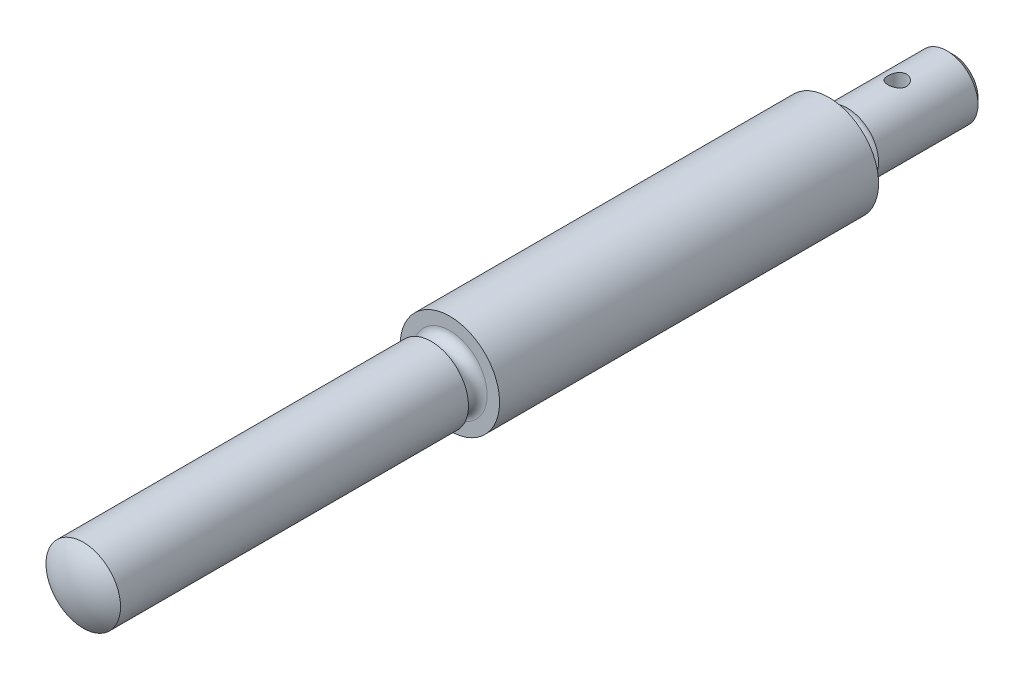
ISO-10303-21;
HEADER;
FILE_DESCRIPTION(('STEP AP214'),'2;1');
FILE_NAME('part.step','',(''),(''),'','','');
FILE_SCHEMA(('AUTOMOTIVE_DESIGN { 1 0 10303 214 1 1 1 1 }'));
ENDSEC;
DATA;
#1=APPLICATION_CONTEXT('core data for automotive mechanical design processes');
#2=APPLICATION_PROTOCOL_DEFINITION('international standard','automotive_design',2000,#1);
#3=PRODUCT_CONTEXT('',#1,'mechanical');
#4=PRODUCT('Part','Part','',(#3));
#5=PRODUCT_RELATED_PRODUCT_CATEGORY('part','',(#4));
#6=PRODUCT_DEFINITION_FORMATION('','',#4);
#7=PRODUCT_DEFINITION_CONTEXT('part definition',#1,'design');
#8=PRODUCT_DEFINITION('design','',#6,#7);
#9=PRODUCT_DEFINITION_SHAPE('','',#8);
#10=(LENGTH_UNIT() NAMED_UNIT(*) SI_UNIT(.MILLI.,.METRE.));
#11=(NAMED_UNIT(*) PLANE_ANGLE_UNIT() SI_UNIT($,.RADIAN.));
#12=(NAMED_UNIT(*) SI_UNIT($,.STERADIAN.) SOLID_ANGLE_UNIT());
#13=UNCERTAINTY_MEASURE_WITH_UNIT(LENGTH_MEASURE(1.E-05),#10,'distance_accuracy_value','');
#14=(GEOMETRIC_REPRESENTATION_CONTEXT(3) GLOBAL_UNCERTAINTY_ASSIGNED_CONTEXT((#13)) GLOBAL_UNIT_ASSIGNED_CONTEXT((#10,
#11,#12)) REPRESENTATION_CONTEXT('',''));
#15=CARTESIAN_POINT('',(0.,0.,0.));
#16=DIRECTION('',(0.,0.,1.));
#17=DIRECTION('',(1.,0.,0.));
#18=AXIS2_PLACEMENT_3D('',#15,#16,#17);
#19=CARTESIAN_POINT('',(0.,0.,-10.));
#20=DIRECTION('',(0.,0.,1.));
#21=DIRECTION('',(0.,1.,0.));
#22=AXIS2_PLACEMENT_3D('',#19,#20,#21);
#23=SPHERICAL_SURFACE('',#22,10.);
#24=CARTESIAN_POINT('',(0.,0.,-2.));
#25=DIRECTION('',(0.,0.,1.));
#26=DIRECTION('',(1.,0.,0.));
#27=AXIS2_PLACEMENT_3D('',#24,#25,#26);
#28=CIRCLE('',#27,6.);
#29=CARTESIAN_POINT('',(6.,0.,-2.));
#30=VERTEX_POINT('',#29);
#31=EDGE_CURVE('E53',#30,#30,#28,.T.);
#32=ORIENTED_EDGE('',*,*,#31,.T.);
#33=EDGE_LOOP('',(#32));
#34=FACE_BOUND('',#33,.T.);
#35=ADVANCED_FACE('F28',(#34),#23,.T.);
#36=CARTESIAN_POINT('',(0.,5.,-142.));
#37=DIRECTION('',(0.,0.,1.));
#38=DIRECTION('',(1.,0.,0.));
#39=AXIS2_PLACEMENT_3D('',#36,#37,#38);
#40=PLANE('',#39);
#41=CARTESIAN_POINT('',(0.,0.,-142.));
#42=DIRECTION('',(0.,0.,1.));
#43=DIRECTION('',(1.,0.,0.));
#44=AXIS2_PLACEMENT_3D('',#41,#42,#43);
#45=CIRCLE('',#44,4.00000000000002);
#46=CARTESIAN_POINT('',(4.00000000000002,0.,-142.));
#47=VERTEX_POINT('',#46);
#48=EDGE_CURVE('E10',#47,#47,#45,.F.);
#49=ORIENTED_EDGE('',*,*,#48,.T.);
#50=EDGE_LOOP('',(#49));
#51=FACE_BOUND('',#50,.T.);
#52=ADVANCED_FACE('F92',(#51),#40,.F.);
#53=CARTESIAN_POINT('',(0.,0.,0.));
#54=DIRECTION('',(0.,0.,1.));
#55=DIRECTION('',(1.,0.,0.));
#56=AXIS2_PLACEMENT_3D('',#53,#54,#55);
#57=CYLINDRICAL_SURFACE('',#56,5.);
#58=CARTESIAN_POINT('',(0.,0.,-141.));
#59=DIRECTION('',(0.,0.,1.));
#60=DIRECTION('',(1.,0.,0.));
#61=AXIS2_PLACEMENT_3D('',#58,#59,#60);
#62=CIRCLE('',#61,5.);
#63=CARTESIAN_POINT('',(5.,0.,-141.));
#64=VERTEX_POINT('',#63);
#65=EDGE_CURVE('E35',#64,#64,#62,.T.);
#66=ORIENTED_EDGE('',*,*,#65,.T.);
#67=EDGE_LOOP('',(#66));
#68=FACE_BOUND('',#67,.T.);
#69=CARTESIAN_POINT('',(0.,-5.,-131.5));
#70=CARTESIAN_POINT('',(0.0822886127532996,-4.9999992925055,-131.500000997485));
#71=CARTESIAN_POINT('',(0.16458731835153,-4.99794915693954,-131.506793863624));
#72=CARTESIAN_POINT('',(0.32678812530488,-4.98997105593691,-131.533721354222));
#73=CARTESIAN_POINT('',(0.406689504411418,-4.98404193389692,-131.553859958023));
#74=CARTESIAN_POINT('',(0.561732707754521,-4.96895552501837,-131.60674601691));
#75=CARTESIAN_POINT('',(0.636881364395366,-4.95980300250426,-131.639474869619));
#76=CARTESIAN_POINT('',(0.780624181053126,-4.93922109237646,-131.716536093056));
#77=CARTESIAN_POINT('',(0.849217467469667,-4.92779140192067,-131.760870007395));
#78=CARTESIAN_POINT('',(0.979871797183742,-4.90350737192774,-131.861224007473));
#79=CARTESIAN_POINT('',(1.04171807124433,-4.89062383657037,-131.917516625886));
#80=CARTESIAN_POINT('',(1.15524920923323,-4.86505834210443,-132.03960922991));
#81=CARTESIAN_POINT('',(1.2069323632744,-4.85237641724502,-132.105410812125));
#82=CARTESIAN_POINT('',(1.29980037723707,-4.82834113993772,-132.246470753038));
#83=CARTESIAN_POINT('',(1.34072309022212,-4.81702406663875,-132.321908460991));
#84=CARTESIAN_POINT('',(1.4092139477476,-4.79743620394031,-132.47898925423));
#85=CARTESIAN_POINT('',(1.43678529919973,-4.78916468313311,-132.560630843928));
#86=CARTESIAN_POINT('',(1.47701633682651,-4.77690870838434,-132.72539026613));
#87=CARTESIAN_POINT('',(1.49007196234677,-4.77281069324533,-132.808402743864));
#88=CARTESIAN_POINT('',(1.50213730614672,-4.76902789749767,-132.975533156217));
#89=CARTESIAN_POINT('',(1.50115042761078,-4.76934204760571,-133.059650818059));
#90=CARTESIAN_POINT('',(1.48546977199812,-4.77424744067778,-133.223383908608));
#91=CARTESIAN_POINT('',(1.47127205262686,-4.77868388599141,-133.303052250362));
#92=CARTESIAN_POINT('',(1.43037420427057,-4.79108356228624,-133.458819786273));
#93=CARTESIAN_POINT('',(1.40367284141642,-4.7990471413235,-133.534918627374));
#94=CARTESIAN_POINT('',(1.33816026653683,-4.81772733074973,-133.682600349661));
#95=CARTESIAN_POINT('',(1.29918816934644,-4.82848016115952,-133.754107083955));
#96=CARTESIAN_POINT('',(1.21035222588685,-4.85150987000064,-133.88973202201));
#97=CARTESIAN_POINT('',(1.16048574002589,-4.86378711746991,-133.953848429414));
#98=CARTESIAN_POINT('',(1.04881290765548,-4.88911011297937,-134.075686190762));
#99=CARTESIAN_POINT('',(0.986594907466989,-4.90216654310498,-134.13302866403));
#100=CARTESIAN_POINT('',(0.85326325931398,-4.92712244063258,-134.236553984064));
#101=CARTESIAN_POINT('',(0.782149051860893,-4.9390218351841,-134.282736128414));
#102=CARTESIAN_POINT('',(0.632355038342801,-4.9604316006947,-134.362859922465));
#103=CARTESIAN_POINT('',(0.553627749747948,-4.96992543668314,-134.39671751625));
#104=CARTESIAN_POINT('',(0.391245415603517,-4.98533521832222,-134.4505995901));
#105=CARTESIAN_POINT('',(0.30759175158958,-4.99125216186999,-134.470627928533));
#106=CARTESIAN_POINT('',(0.140952242668333,-4.99868364643538,-134.495652177899));
#107=CARTESIAN_POINT('',(0.0580500976011894,-5.0003485041779,-134.501161585802));
#108=CARTESIAN_POINT('',(-0.107499605823379,-4.9995292324176,-134.498430844288));
#109=CARTESIAN_POINT('',(-0.190147196690776,-4.99704565677757,-134.490192530349));
#110=CARTESIAN_POINT('',(-0.350903605309691,-4.98830696987163,-134.460615388888));
#111=CARTESIAN_POINT('',(-0.429072772614163,-4.98213829799417,-134.439576612419));
#112=CARTESIAN_POINT('',(-0.580754638954516,-4.96674347841533,-134.385356767222));
#113=CARTESIAN_POINT('',(-0.654266777025579,-4.95751696321085,-134.352174238962));
#114=CARTESIAN_POINT('',(-0.796437189461048,-4.93669654351325,-134.273746834519));
#115=CARTESIAN_POINT('',(-0.864943826199664,-4.92505280829675,-134.228240659052));
#116=CARTESIAN_POINT('',(-0.993523307980143,-4.90073468764318,-134.126775245947));
#117=CARTESIAN_POINT('',(-1.05359403235593,-4.8880600443108,-134.070813388112));
#118=CARTESIAN_POINT('',(-1.16585744551028,-4.86253171869138,-133.947612691631));
#119=CARTESIAN_POINT('',(-1.21768481231505,-4.84968825033267,-133.880038124228));
#120=CARTESIAN_POINT('',(-1.30928995072154,-4.82576515238463,-133.736872060986));
#121=CARTESIAN_POINT('',(-1.34906803829472,-4.81468547654651,-133.661280775442));
#122=CARTESIAN_POINT('',(-1.41517347127168,-4.79567189615055,-133.504467508745));
#123=CARTESIAN_POINT('',(-1.4415634693705,-4.78772337843827,-133.423273813463));
#124=CARTESIAN_POINT('',(-1.48021730815114,-4.77591594362794,-133.257312031069));
#125=CARTESIAN_POINT('',(-1.49248598978779,-4.772055625083,-133.172545179212));
#126=CARTESIAN_POINT('',(-1.50221984485059,-4.76899972496087,-133.005638481624));
#127=CARTESIAN_POINT('',(-1.5002805530849,-4.76961647442754,-132.923536348982));
#128=CARTESIAN_POINT('',(-1.48307505444813,-4.77499401288294,-132.760885896627));
#129=CARTESIAN_POINT('',(-1.46780938124716,-4.77975463592551,-132.680337514824));
#130=CARTESIAN_POINT('',(-1.42476888804135,-4.79275763670386,-132.524054600857));
#131=CARTESIAN_POINT('',(-1.39715175507068,-4.80095604545965,-132.448272712638));
#132=CARTESIAN_POINT('',(-1.33031507121128,-4.81990278909137,-132.302357561182));
#133=CARTESIAN_POINT('',(-1.29109329962875,-4.83065161194312,-132.232225382359));
#134=CARTESIAN_POINT('',(-1.20048763805071,-4.85397676425833,-132.096836883473));
#135=CARTESIAN_POINT('',(-1.14871276092994,-4.86660540163798,-132.03185123874));
#136=CARTESIAN_POINT('',(-1.03517434629782,-4.89201320450026,-131.911297501692));
#137=CARTESIAN_POINT('',(-0.973408217134502,-4.90479240823905,-131.855731860532));
#138=CARTESIAN_POINT('',(-0.839465762183243,-4.92950936570649,-131.753976587705));
#139=CARTESIAN_POINT('',(-0.7670378857906,-4.94141159765674,-131.708108553145));
#140=CARTESIAN_POINT('',(-0.615141373983523,-4.96260680455813,-131.629264830096));
#141=CARTESIAN_POINT('',(-0.535676052998952,-4.97190099931067,-131.596283111726));
#142=CARTESIAN_POINT('',(-0.380757712655279,-4.98602174969301,-131.547104724347));
#143=CARTESIAN_POINT('',(-0.30578696195423,-4.99122027381068,-131.529488327117));
#144=CARTESIAN_POINT('',(-0.153880195230776,-4.99820944494492,-131.505936474758));
#145=CARTESIAN_POINT('',(-0.0769445098581383,-5.0000006615474,-131.499999067295));
#146=CARTESIAN_POINT('',(0.,-5.,-131.5));
#147=B_SPLINE_CURVE_WITH_KNOTS('',3,(#69,#70,#71,#72,#73,#74,#75,#76,#77,#78,#79,#80,#81,#82,
#83,#84,#85,#86,#87,#88,#89,#90,#91,#92,#93,#94,#95,#96,#97,#98,#99,#100,#101,#102,#103,#104,
#105,#106,#107,#108,#109,#110,#111,#112,#113,#114,#115,#116,#117,#118,#119,#120,#121,#122,#123,
#124,#125,#126,#127,#128,#129,#130,#131,#132,#133,#134,#135,#136,#137,#138,#139,#140,#141,#142,
#143,#144,#145,#146),.UNSPECIFIED.,.T.,.F.,(4,2,2,2,2,2,2,2,2,2,2,2,2,2,2,2,2,2,2,2,2,2,2,2,2,2,
2,2,2,2,2,2,2,2,2,2,2,2,4),(0.,0.246583203612611,0.493239964845998,0.739533676300867,
0.98586016441269,1.2385560294819,1.49129437288632,1.74971481004104,2.00807314543225,
2.25919689356599,2.51025978319089,2.75226016697672,2.99428443657998,3.23962426447116,
3.48502360158553,3.74067104048165,3.9963345653107,4.25371046881689,4.51101453528807,
4.75908809438544,5.00712853550326,5.24956746682326,5.49203554593728,5.74011305702908,
5.98825282000192,6.2454040032282,6.5025484425268,6.75847814951252,7.01432009460282,
7.25950155466945,7.50467319661602,7.74680040402721,7.98897397553108,8.2399692567993,
8.49102974897501,8.7494299615667,9.00770911595235,9.23831691930459,9.46888616948873),.UNSPECIFIED.);
#148=CARTESIAN_POINT('',(0.,-5.,-131.5));
#149=VERTEX_POINT('',#148);
#150=EDGE_CURVE('E46',#149,#149,#147,.T.);
#151=ORIENTED_EDGE('',*,*,#150,.T.);
#152=EDGE_LOOP('',(#151));
#153=FACE_BOUND('',#152,.T.);
#154=CARTESIAN_POINT('',(0.,5.,-131.5));
#155=CARTESIAN_POINT('',(-0.0822886127532996,4.9999992925055,-131.500000997485));
#156=CARTESIAN_POINT('',(-0.16458731835153,4.99794915693954,-131.506793863624));
#157=CARTESIAN_POINT('',(-0.32678812530488,4.98997105593691,-131.533721354222));
#158=CARTESIAN_POINT('',(-0.406689504411418,4.98404193389692,-131.553859958023));
#159=CARTESIAN_POINT('',(-0.561732707754521,4.96895552501837,-131.60674601691));
#160=CARTESIAN_POINT('',(-0.636881364395366,4.95980300250426,-131.639474869619));
#161=CARTESIAN_POINT('',(-0.780624181053126,4.93922109237646,-131.716536093056));
#162=CARTESIAN_POINT('',(-0.849217467469667,4.92779140192067,-131.760870007395));
#163=CARTESIAN_POINT('',(-0.979871797183742,4.90350737192774,-131.861224007473));
#164=CARTESIAN_POINT('',(-1.04171807124433,4.89062383657037,-131.917516625886));
#165=CARTESIAN_POINT('',(-1.15524920923323,4.86505834210443,-132.03960922991));
#166=CARTESIAN_POINT('',(-1.2069323632744,4.85237641724502,-132.105410812125));
#167=CARTESIAN_POINT('',(-1.29980037723707,4.82834113993772,-132.246470753038));
#168=CARTESIAN_POINT('',(-1.34072309022212,4.81702406663875,-132.321908460991));
#169=CARTESIAN_POINT('',(-1.4092139477476,4.79743620394031,-132.47898925423));
#170=CARTESIAN_POINT('',(-1.43678529919973,4.78916468313311,-132.560630843928));
#171=CARTESIAN_POINT('',(-1.47701633682651,4.77690870838434,-132.72539026613));
#172=CARTESIAN_POINT('',(-1.49007196234677,4.77281069324533,-132.808402743864));
#173=CARTESIAN_POINT('',(-1.50213730614672,4.76902789749767,-132.975533156217));
#174=CARTESIAN_POINT('',(-1.50115042761078,4.76934204760571,-133.059650818059));
#175=CARTESIAN_POINT('',(-1.48546977199812,4.77424744067778,-133.223383908608));
#176=CARTESIAN_POINT('',(-1.47127205262686,4.77868388599141,-133.303052250362));
#177=CARTESIAN_POINT('',(-1.43037420427057,4.79108356228624,-133.458819786273));
#178=CARTESIAN_POINT('',(-1.40367284141642,4.7990471413235,-133.534918627374));
#179=CARTESIAN_POINT('',(-1.33816026653683,4.81772733074973,-133.682600349661));
#180=CARTESIAN_POINT('',(-1.29918816934644,4.82848016115952,-133.754107083955));
#181=CARTESIAN_POINT('',(-1.21035222588685,4.85150987000064,-133.88973202201));
#182=CARTESIAN_POINT('',(-1.16048574002589,4.86378711746991,-133.953848429414));
#183=CARTESIAN_POINT('',(-1.04881290765548,4.88911011297937,-134.075686190762));
#184=CARTESIAN_POINT('',(-0.986594907466989,4.90216654310498,-134.13302866403));
#185=CARTESIAN_POINT('',(-0.85326325931398,4.92712244063258,-134.236553984064));
#186=CARTESIAN_POINT('',(-0.782149051860893,4.9390218351841,-134.282736128414));
#187=CARTESIAN_POINT('',(-0.632355038342801,4.9604316006947,-134.362859922465));
#188=CARTESIAN_POINT('',(-0.553627749747948,4.96992543668314,-134.39671751625));
#189=CARTESIAN_POINT('',(-0.391245415603517,4.98533521832222,-134.4505995901));
#190=CARTESIAN_POINT('',(-0.30759175158958,4.99125216186999,-134.470627928533));
#191=CARTESIAN_POINT('',(-0.140952242668333,4.99868364643538,-134.495652177899));
#192=CARTESIAN_POINT('',(-0.0580500976011894,5.0003485041779,-134.501161585802));
#193=CARTESIAN_POINT('',(0.107499605823379,4.9995292324176,-134.498430844288));
#194=CARTESIAN_POINT('',(0.190147196690776,4.99704565677757,-134.490192530349));
#195=CARTESIAN_POINT('',(0.350903605309691,4.98830696987163,-134.460615388888));
#196=CARTESIAN_POINT('',(0.429072772614163,4.98213829799417,-134.439576612419));
#197=CARTESIAN_POINT('',(0.580754638954516,4.96674347841533,-134.385356767222));
#198=CARTESIAN_POINT('',(0.654266777025579,4.95751696321085,-134.352174238962));
#199=CARTESIAN_POINT('',(0.796437189461048,4.93669654351325,-134.273746834519));
#200=CARTESIAN_POINT('',(0.864943826199664,4.92505280829675,-134.228240659052));
#201=CARTESIAN_POINT('',(0.993523307980143,4.90073468764318,-134.126775245947));
#202=CARTESIAN_POINT('',(1.05359403235593,4.8880600443108,-134.070813388112));
#203=CARTESIAN_POINT('',(1.16585744551028,4.86253171869138,-133.947612691631));
#204=CARTESIAN_POINT('',(1.21768481231505,4.84968825033267,-133.880038124228));
#205=CARTESIAN_POINT('',(1.30928995072154,4.82576515238463,-133.736872060986));
#206=CARTESIAN_POINT('',(1.34906803829472,4.81468547654651,-133.661280775442));
#207=CARTESIAN_POINT('',(1.41517347127168,4.79567189615055,-133.504467508745));
#208=CARTESIAN_POINT('',(1.4415634693705,4.78772337843827,-133.423273813463));
#209=CARTESIAN_POINT('',(1.48021730815114,4.77591594362794,-133.257312031069));
#210=CARTESIAN_POINT('',(1.49248598978779,4.772055625083,-133.172545179212));
#211=CARTESIAN_POINT('',(1.50221984485059,4.76899972496087,-133.005638481624));
#212=CARTESIAN_POINT('',(1.5002805530849,4.76961647442754,-132.923536348982));
#213=CARTESIAN_POINT('',(1.48307505444813,4.77499401288294,-132.760885896627));
#214=CARTESIAN_POINT('',(1.46780938124716,4.77975463592551,-132.680337514824));
#215=CARTESIAN_POINT('',(1.42476888804135,4.79275763670386,-132.524054600857));
#216=CARTESIAN_POINT('',(1.39715175507068,4.80095604545965,-132.448272712638));
#217=CARTESIAN_POINT('',(1.33031507121128,4.81990278909137,-132.302357561182));
#218=CARTESIAN_POINT('',(1.29109329962875,4.83065161194312,-132.232225382359));
#219=CARTESIAN_POINT('',(1.20048763805071,4.85397676425833,-132.096836883473));
#220=CARTESIAN_POINT('',(1.14871276092994,4.86660540163798,-132.03185123874));
#221=CARTESIAN_POINT('',(1.03517434629782,4.89201320450026,-131.911297501692));
#222=CARTESIAN_POINT('',(0.973408217134502,4.90479240823905,-131.855731860532));
#223=CARTESIAN_POINT('',(0.839465762183243,4.92950936570649,-131.753976587705));
#224=CARTESIAN_POINT('',(0.7670378857906,4.94141159765674,-131.708108553145));
#225=CARTESIAN_POINT('',(0.615141373983523,4.96260680455813,-131.629264830096));
#226=CARTESIAN_POINT('',(0.535676052998952,4.97190099931067,-131.596283111726));
#227=CARTESIAN_POINT('',(0.380757712655279,4.98602174969301,-131.547104724347));
#228=CARTESIAN_POINT('',(0.30578696195423,4.99122027381068,-131.529488327117));
#229=CARTESIAN_POINT('',(0.153880195230776,4.99820944494492,-131.505936474758));
#230=CARTESIAN_POINT('',(0.0769445098581383,5.0000006615474,-131.499999067295));
#231=CARTESIAN_POINT('',(0.,5.,-131.5));
#232=B_SPLINE_CURVE_WITH_KNOTS('',3,(#154,#155,#156,#157,#158,#159,#160,#161,#162,#163,#164,
#165,#166,#167,#168,#169,#170,#171,#172,#173,#174,#175,#176,#177,#178,#179,#180,#181,#182,#183,
#184,#185,#186,#187,#188,#189,#190,#191,#192,#193,#194,#195,#196,#197,#198,#199,#200,#201,#202,
#203,#204,#205,#206,#207,#208,#209,#210,#211,#212,#213,#214,#215,#216,#217,#218,#219,#220,#221,
#222,#223,#224,#225,#226,#227,#228,#229,#230,#231),.UNSPECIFIED.,.T.,.F.,(4,2,2,2,2,2,2,2,2,2,2,
2,2,2,2,2,2,2,2,2,2,2,2,2,2,2,2,2,2,2,2,2,2,2,2,2,2,2,4),(0.,0.246583203612611,
0.493239964845998,0.739533676300867,0.98586016441269,1.2385560294819,1.49129437288632,
1.74971481004104,2.00807314543225,2.25919689356599,2.51025978319089,2.75226016697672,
2.99428443657998,3.23962426447116,3.48502360158553,3.74067104048165,3.9963345653107,
4.25371046881689,4.51101453528807,4.75908809438544,5.00712853550326,5.24956746682326,
5.49203554593728,5.74011305702908,5.98825282000192,6.2454040032282,6.5025484425268,
6.75847814951252,7.01432009460282,7.25950155466945,7.50467319661602,7.74680040402721,
7.98897397553108,8.2399692567993,8.49102974897501,8.7494299615667,9.00770911595235,
9.23831691930459,9.46888616948873),.UNSPECIFIED.);
#233=CARTESIAN_POINT('',(0.,5.,-131.5));
#234=VERTEX_POINT('',#233);
#235=EDGE_CURVE('E54',#234,#234,#232,.T.);
#236=ORIENTED_EDGE('',*,*,#235,.T.);
#237=EDGE_LOOP('',(#236));
#238=FACE_BOUND('',#237,.T.);
#239=CARTESIAN_POINT('',(0.,0.,-125.));
#240=DIRECTION('',(0.,0.,1.));
#241=DIRECTION('',(1.,0.,0.));
#242=AXIS2_PLACEMENT_3D('',#239,#240,#241);
#243=CIRCLE('',#242,5.);
#244=CARTESIAN_POINT('',(5.,0.,-125.));
#245=VERTEX_POINT('',#244);
#246=EDGE_CURVE('E39',#245,#245,#243,.T.);
#247=ORIENTED_EDGE('',*,*,#246,.F.);
#248=EDGE_LOOP('',(#247));
#249=FACE_BOUND('',#248,.T.);
#250=ADVANCED_FACE('F57',(#68,#153,#238,#249),#57,.T.);
#251=CARTESIAN_POINT('',(0.,0.,-123.5));
#252=DIRECTION('',(0.,0.,1.));
#253=DIRECTION('',(1.,0.,0.));
#254=AXIS2_PLACEMENT_3D('',#251,#252,#253);
#255=TOROIDAL_SURFACE('',#254,5.,1.5);
#256=CARTESIAN_POINT('',(0.,0.,-122.));
#257=DIRECTION('',(0.,0.,1.));
#258=DIRECTION('',(1.,0.,0.));
#259=AXIS2_PLACEMENT_3D('',#256,#257,#258);
#260=CIRCLE('',#259,5.);
#261=CARTESIAN_POINT('',(5.,0.,-122.));
#262=VERTEX_POINT('',#261);
#263=EDGE_CURVE('E43',#262,#262,#260,.T.);
#264=ORIENTED_EDGE('',*,*,#263,.F.);
#265=EDGE_LOOP('',(#264));
#266=FACE_BOUND('',#265,.T.);
#267=ORIENTED_EDGE('',*,*,#246,.T.);
#268=EDGE_LOOP('',(#267));
#269=FACE_BOUND('',#268,.T.);
#270=ADVANCED_FACE('F85',(#266,#269),#255,.F.);
#271=CARTESIAN_POINT('',(0.,7.99999999999999,-122.));
#272=DIRECTION('',(0.,0.,1.));
#273=DIRECTION('',(1.,0.,0.));
#274=AXIS2_PLACEMENT_3D('',#271,#272,#273);
#275=PLANE('',#274);
#276=CARTESIAN_POINT('',(0.,0.,-122.));
#277=DIRECTION('',(0.,0.,1.));
#278=DIRECTION('',(1.,0.,0.));
#279=AXIS2_PLACEMENT_3D('',#276,#277,#278);
#280=CIRCLE('',#279,7.99999999999999);
#281=CARTESIAN_POINT('',(7.99999999999999,0.,-122.));
#282=VERTEX_POINT('',#281);
#283=EDGE_CURVE('E113',#282,#282,#280,.T.);
#284=ORIENTED_EDGE('',*,*,#283,.F.);
#285=EDGE_LOOP('',(#284));
#286=FACE_BOUND('',#285,.T.);
#287=ORIENTED_EDGE('',*,*,#263,.T.);
#288=EDGE_LOOP('',(#287));
#289=FACE_BOUND('',#288,.T.);
#290=ADVANCED_FACE('F82',(#286,#289),#275,.F.);
#291=CARTESIAN_POINT('',(0.,0.,0.));
#292=DIRECTION('',(0.,0.,1.));
#293=DIRECTION('',(1.,0.,0.));
#294=AXIS2_PLACEMENT_3D('',#291,#292,#293);
#295=CYLINDRICAL_SURFACE('',#294,7.99999999999999);
#296=CARTESIAN_POINT('',(0.,0.,-61.));
#297=DIRECTION('',(0.,0.,1.));
#298=DIRECTION('',(1.,0.,0.));
#299=AXIS2_PLACEMENT_3D('',#296,#297,#298);
#300=CIRCLE('',#299,7.99999999999999);
#301=CARTESIAN_POINT('',(7.99999999999999,0.,-61.));
#302=VERTEX_POINT('',#301);
#303=EDGE_CURVE('E110',#302,#302,#300,.T.);
#304=ORIENTED_EDGE('',*,*,#303,.F.);
#305=EDGE_LOOP('',(#304));
#306=FACE_BOUND('',#305,.T.);
#307=ORIENTED_EDGE('',*,*,#283,.T.);
#308=EDGE_LOOP('',(#307));
#309=FACE_BOUND('',#308,.T.);
#310=ADVANCED_FACE('F78',(#306,#309),#295,.T.);
#311=CARTESIAN_POINT('',(0.,6.,-61.));
#312=DIRECTION('',(0.,0.,-1.));
#313=DIRECTION('',(-1.,0.,0.));
#314=AXIS2_PLACEMENT_3D('',#311,#312,#313);
#315=PLANE('',#314);
#316=CARTESIAN_POINT('',(0.,0.,-61.));
#317=DIRECTION('',(0.,0.,1.));
#318=DIRECTION('',(1.,0.,0.));
#319=AXIS2_PLACEMENT_3D('',#316,#317,#318);
#320=CIRCLE('',#319,6.);
#321=CARTESIAN_POINT('',(6.,0.,-61.));
#322=VERTEX_POINT('',#321);
#323=EDGE_CURVE('E105',#322,#322,#320,.T.);
#324=ORIENTED_EDGE('',*,*,#323,.F.);
#325=EDGE_LOOP('',(#324));
#326=FACE_BOUND('',#325,.T.);
#327=ORIENTED_EDGE('',*,*,#303,.T.);
#328=EDGE_LOOP('',(#327));
#329=FACE_BOUND('',#328,.T.);
#330=ADVANCED_FACE('F74',(#326,#329),#315,.F.);
#331=CARTESIAN_POINT('',(0.,0.,-59.5));
#332=DIRECTION('',(0.,0.,1.));
#333=DIRECTION('',(1.,0.,0.));
#334=AXIS2_PLACEMENT_3D('',#331,#332,#333);
#335=TOROIDAL_SURFACE('',#334,6.,1.5);
#336=CARTESIAN_POINT('',(0.,0.,-58.));
#337=DIRECTION('',(0.,0.,1.));
#338=DIRECTION('',(1.,0.,0.));
#339=AXIS2_PLACEMENT_3D('',#336,#337,#338);
#340=CIRCLE('',#339,6.);
#341=CARTESIAN_POINT('',(6.,0.,-58.));
#342=VERTEX_POINT('',#341);
#343=EDGE_CURVE('E102',#342,#342,#340,.T.);
#344=ORIENTED_EDGE('',*,*,#343,.F.);
#345=EDGE_LOOP('',(#344));
#346=FACE_BOUND('',#345,.T.);
#347=ORIENTED_EDGE('',*,*,#323,.T.);
#348=EDGE_LOOP('',(#347));
#349=FACE_BOUND('',#348,.T.);
#350=ADVANCED_FACE('F70',(#346,#349),#335,.F.);
#351=CARTESIAN_POINT('',(0.,0.,0.));
#352=DIRECTION('',(0.,0.,1.));
#353=DIRECTION('',(1.,0.,0.));
#354=AXIS2_PLACEMENT_3D('',#351,#352,#353);
#355=CYLINDRICAL_SURFACE('',#354,6.);
#356=ORIENTED_EDGE('',*,*,#31,.F.);
#357=EDGE_LOOP('',(#356));
#358=FACE_BOUND('',#357,.T.);
#359=ORIENTED_EDGE('',*,*,#343,.T.);
#360=EDGE_LOOP('',(#359));
#361=FACE_BOUND('',#360,.T.);
#362=ADVANCED_FACE('F65',(#358,#361),#355,.T.);
#363=CARTESIAN_POINT('',(0.,-10.,-133.));
#364=DIRECTION('',(0.,1.,0.));
#365=DIRECTION('',(0.,0.,1.));
#366=AXIS2_PLACEMENT_3D('',#363,#364,#365);
#367=CYLINDRICAL_SURFACE('',#366,1.5);
#368=ORIENTED_EDGE('',*,*,#235,.F.);
#369=EDGE_LOOP('',(#368));
#370=FACE_BOUND('',#369,.T.);
#371=ORIENTED_EDGE('',*,*,#150,.F.);
#372=EDGE_LOOP('',(#371));
#373=FACE_BOUND('',#372,.T.);
#374=ADVANCED_FACE('F61',(#370,#373),#367,.F.);
#375=CARTESIAN_POINT('',(0.,0.,-141.));
#376=DIRECTION('',(0.,0.,1.));
#377=DIRECTION('',(1.,0.,0.));
#378=AXIS2_PLACEMENT_3D('',#375,#376,#377);
#379=CONICAL_SURFACE('',#378,5.,0.78539816339744);
#380=ORIENTED_EDGE('',*,*,#48,.F.);
#381=EDGE_LOOP('',(#380));
#382=FACE_BOUND('',#381,.T.);
#383=ORIENTED_EDGE('',*,*,#65,.F.);
#384=EDGE_LOOP('',(#383));
#385=FACE_BOUND('',#384,.T.);
#386=ADVANCED_FACE('F30',(#382,#385),#379,.T.);
#387=CLOSED_SHELL('',(#35,#52,#250,#270,#290,#310,#330,#350,#362,#374,#386));
#388=MANIFOLD_SOLID_BREP('B2',#387);
#389=ADVANCED_BREP_SHAPE_REPRESENTATION('',(#18,#388),#14);
#390=SHAPE_DEFINITION_REPRESENTATION(#9,#389);
ENDSEC;
END-ISO-10303-21;
